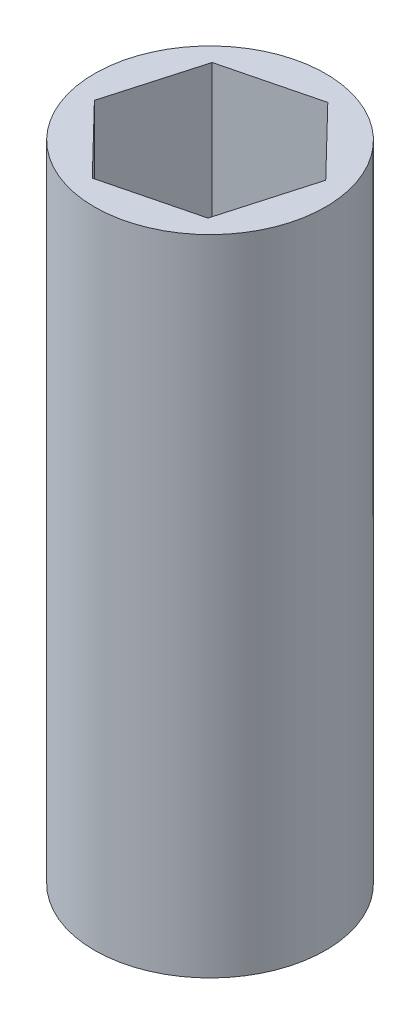
ISO-10303-21;
HEADER;
FILE_DESCRIPTION(('STEP AP214'),'2;1');
FILE_NAME('part.step','',(''),(''),'','','');
FILE_SCHEMA(('AUTOMOTIVE_DESIGN { 1 0 10303 214 1 1 1 1 }'));
ENDSEC;
DATA;
#1=APPLICATION_CONTEXT('core data for automotive mechanical design processes');
#2=APPLICATION_PROTOCOL_DEFINITION('international standard','automotive_design',2000,#1);
#3=PRODUCT_CONTEXT('',#1,'mechanical');
#4=PRODUCT('Part','Part','',(#3));
#5=PRODUCT_RELATED_PRODUCT_CATEGORY('part','',(#4));
#6=PRODUCT_DEFINITION_FORMATION('','',#4);
#7=PRODUCT_DEFINITION_CONTEXT('part definition',#1,'design');
#8=PRODUCT_DEFINITION('design','',#6,#7);
#9=PRODUCT_DEFINITION_SHAPE('','',#8);
#10=(LENGTH_UNIT() NAMED_UNIT(*) SI_UNIT(.MILLI.,.METRE.));
#11=(NAMED_UNIT(*) PLANE_ANGLE_UNIT() SI_UNIT($,.RADIAN.));
#12=(NAMED_UNIT(*) SI_UNIT($,.STERADIAN.) SOLID_ANGLE_UNIT());
#13=UNCERTAINTY_MEASURE_WITH_UNIT(LENGTH_MEASURE(1.E-05),#10,'distance_accuracy_value','');
#14=(GEOMETRIC_REPRESENTATION_CONTEXT(3) GLOBAL_UNCERTAINTY_ASSIGNED_CONTEXT((#13)) GLOBAL_UNIT_ASSIGNED_CONTEXT((#10,
#11,#12)) REPRESENTATION_CONTEXT('',''));
#15=CARTESIAN_POINT('',(0.,0.,0.));
#16=DIRECTION('',(0.,0.,1.));
#17=DIRECTION('',(1.,0.,0.));
#18=AXIS2_PLACEMENT_3D('',#15,#16,#17);
#19=CARTESIAN_POINT('',(0.,49.53,0.));
#20=DIRECTION('',(0.,1.,0.));
#21=DIRECTION('',(0.,0.,1.));
#22=AXIS2_PLACEMENT_3D('',#19,#20,#21);
#23=PLANE('',#22);
#24=CARTESIAN_POINT('',(0.,49.53,0.));
#25=DIRECTION('',(0.,1.,0.));
#26=DIRECTION('',(0.,0.,1.));
#27=AXIS2_PLACEMENT_3D('',#24,#25,#26);
#28=CIRCLE('',#27,8.89);
#29=CARTESIAN_POINT('',(0.,49.53,8.89));
#30=VERTEX_POINT('',#29);
#31=EDGE_CURVE('E11',#30,#30,#28,.T.);
#32=ORIENTED_EDGE('',*,*,#31,.T.);
#33=EDGE_LOOP('',(#32));
#34=FACE_BOUND('',#33,.T.);
#35=DIRECTION('',(-0.969830096251339,0.,0.243781837726108));
#36=VECTOR('',#35,1.);
#37=CARTESIAN_POINT('',(2.0075514167713,49.53,-7.05216779737641));
#38=LINE('',#37,#36);
#39=CARTESIAN_POINT('',(2.0075514167713,49.53,-7.05216779737641));
#40=VERTEX_POINT('',#39);
#41=CARTESIAN_POINT('',(-5.10358075589287,49.53,-5.2646744250156));
#42=VERTEX_POINT('',#41);
#43=EDGE_CURVE('E94',#40,#42,#38,.T.);
#44=ORIENTED_EDGE('',*,*,#43,.F.);
#45=DIRECTION('',(-0.696036312577735,0.,-0.718006581845313));
#46=VECTOR('',#45,1.);
#47=CARTESIAN_POINT('',(7.11113217266417,49.53,-1.78749337236082));
#48=LINE('',#47,#46);
#49=CARTESIAN_POINT('',(7.11113217266417,49.53,-1.78749337236082));
#50=VERTEX_POINT('',#49);
#51=EDGE_CURVE('E86',#50,#40,#48,.T.);
#52=ORIENTED_EDGE('',*,*,#51,.F.);
#53=DIRECTION('',(0.273793783673605,0.,-0.961788419571421));
#54=VECTOR('',#53,1.);
#55=CARTESIAN_POINT('',(5.10358075589287,49.53,5.2646744250156));
#56=LINE('',#55,#54);
#57=CARTESIAN_POINT('',(5.10358075589287,49.53,5.26467442501559));
#58=VERTEX_POINT('',#57);
#59=EDGE_CURVE('E114',#58,#50,#56,.T.);
#60=ORIENTED_EDGE('',*,*,#59,.F.);
#61=DIRECTION('',(0.969830096251339,0.,-0.243781837726108));
#62=VECTOR('',#61,1.);
#63=CARTESIAN_POINT('',(-2.0075514167713,49.53,7.05216779737641));
#64=LINE('',#63,#62);
#65=CARTESIAN_POINT('',(-2.0075514167713,49.53,7.05216779737641));
#66=VERTEX_POINT('',#65);
#67=EDGE_CURVE('E112',#66,#58,#64,.T.);
#68=ORIENTED_EDGE('',*,*,#67,.F.);
#69=DIRECTION('',(0.696036312577734,0.,0.718006581845313));
#70=VECTOR('',#69,1.);
#71=CARTESIAN_POINT('',(-7.11113217266417,49.53,1.78749337236082));
#72=LINE('',#71,#70);
#73=CARTESIAN_POINT('',(-7.11113217266417,49.53,1.78749337236082));
#74=VERTEX_POINT('',#73);
#75=EDGE_CURVE('E108',#74,#66,#72,.T.);
#76=ORIENTED_EDGE('',*,*,#75,.F.);
#77=DIRECTION('',(-0.273793783673604,0.,0.961788419571421));
#78=VECTOR('',#77,1.);
#79=CARTESIAN_POINT('',(-5.10358075589287,49.53,-5.2646744250156));
#80=LINE('',#79,#78);
#81=EDGE_CURVE('E106',#42,#74,#80,.T.);
#82=ORIENTED_EDGE('',*,*,#81,.F.);
#83=EDGE_LOOP('',(#44,#52,#60,#68,#76,#82));
#84=FACE_BOUND('',#83,.T.);
#85=ADVANCED_FACE('F33',(#34,#84),#23,.T.);
#86=CARTESIAN_POINT('',(0.,0.,0.));
#87=DIRECTION('',(0.,1.,0.));
#88=DIRECTION('',(0.,0.,1.));
#89=AXIS2_PLACEMENT_3D('',#86,#87,#88);
#90=PLANE('',#89);
#91=CARTESIAN_POINT('',(0.,0.,0.));
#92=DIRECTION('',(0.,1.,0.));
#93=DIRECTION('',(0.,0.,1.));
#94=AXIS2_PLACEMENT_3D('',#91,#92,#93);
#95=CIRCLE('',#94,8.89);
#96=CARTESIAN_POINT('',(0.,0.,8.89));
#97=VERTEX_POINT('',#96);
#98=EDGE_CURVE('E37',#97,#97,#95,.T.);
#99=ORIENTED_EDGE('',*,*,#98,.F.);
#100=EDGE_LOOP('',(#99));
#101=FACE_BOUND('',#100,.T.);
#102=DIRECTION('',(-0.696036312577735,0.,-0.718006581845313));
#103=VECTOR('',#102,1.);
#104=CARTESIAN_POINT('',(7.11113217266417,0.,-1.78749337236082));
#105=LINE('',#104,#103);
#106=CARTESIAN_POINT('',(7.11113217266417,0.,-1.78749337236082));
#107=VERTEX_POINT('',#106);
#108=CARTESIAN_POINT('',(2.0075514167713,0.,-7.05216779737641));
#109=VERTEX_POINT('',#108);
#110=EDGE_CURVE('E56',#107,#109,#105,.T.);
#111=ORIENTED_EDGE('',*,*,#110,.T.);
#112=DIRECTION('',(-0.969830096251339,0.,0.243781837726108));
#113=VECTOR('',#112,1.);
#114=CARTESIAN_POINT('',(2.0075514167713,0.,-7.05216779737641));
#115=LINE('',#114,#113);
#116=CARTESIAN_POINT('',(-5.10358075589287,0.,-5.2646744250156));
#117=VERTEX_POINT('',#116);
#118=EDGE_CURVE('E101',#109,#117,#115,.T.);
#119=ORIENTED_EDGE('',*,*,#118,.T.);
#120=DIRECTION('',(-0.273793783673604,0.,0.961788419571421));
#121=VECTOR('',#120,1.);
#122=CARTESIAN_POINT('',(-5.10358075589287,0.,-5.2646744250156));
#123=LINE('',#122,#121);
#124=CARTESIAN_POINT('',(-7.11113217266417,0.,1.78749337236082));
#125=VERTEX_POINT('',#124);
#126=EDGE_CURVE('E118',#117,#125,#123,.T.);
#127=ORIENTED_EDGE('',*,*,#126,.T.);
#128=DIRECTION('',(0.696036312577734,0.,0.718006581845313));
#129=VECTOR('',#128,1.);
#130=CARTESIAN_POINT('',(-7.11113217266417,0.,1.78749337236082));
#131=LINE('',#130,#129);
#132=CARTESIAN_POINT('',(-2.0075514167713,0.,7.05216779737641));
#133=VERTEX_POINT('',#132);
#134=EDGE_CURVE('E121',#125,#133,#131,.T.);
#135=ORIENTED_EDGE('',*,*,#134,.T.);
#136=DIRECTION('',(0.969830096251339,0.,-0.243781837726108));
#137=VECTOR('',#136,1.);
#138=CARTESIAN_POINT('',(-2.0075514167713,0.,7.05216779737641));
#139=LINE('',#138,#137);
#140=CARTESIAN_POINT('',(5.10358075589287,0.,5.2646744250156));
#141=VERTEX_POINT('',#140);
#142=EDGE_CURVE('E124',#133,#141,#139,.T.);
#143=ORIENTED_EDGE('',*,*,#142,.T.);
#144=DIRECTION('',(0.273793783673605,0.,-0.961788419571421));
#145=VECTOR('',#144,1.);
#146=CARTESIAN_POINT('',(5.10358075589287,0.,5.2646744250156));
#147=LINE('',#146,#145);
#148=EDGE_CURVE('E95',#141,#107,#147,.T.);
#149=ORIENTED_EDGE('',*,*,#148,.T.);
#150=EDGE_LOOP('',(#111,#119,#127,#135,#143,#149));
#151=FACE_BOUND('',#150,.T.);
#152=ADVANCED_FACE('F141',(#101,#151),#90,.F.);
#153=CARTESIAN_POINT('',(0.,49.53,0.));
#154=DIRECTION('',(0.,-1.,0.));
#155=DIRECTION('',(0.,0.,-1.));
#156=AXIS2_PLACEMENT_3D('',#153,#154,#155);
#157=CYLINDRICAL_SURFACE('',#156,8.89);
#158=ORIENTED_EDGE('',*,*,#31,.F.);
#159=EDGE_LOOP('',(#158));
#160=FACE_BOUND('',#159,.T.);
#161=ORIENTED_EDGE('',*,*,#98,.T.);
#162=EDGE_LOOP('',(#161));
#163=FACE_BOUND('',#162,.T.);
#164=ADVANCED_FACE('F35',(#160,#163),#157,.T.);
#165=CARTESIAN_POINT('',(7.11113217266417,49.53,-1.78749337236082));
#166=DIRECTION('',(-0.718006581845313,0.,0.696036312577735));
#167=DIRECTION('',(0.696036312577735,0.,0.718006581845313));
#168=AXIS2_PLACEMENT_3D('',#165,#166,#167);
#169=PLANE('',#168);
#170=ORIENTED_EDGE('',*,*,#110,.F.);
#171=DIRECTION('',(0.,-1.,0.));
#172=VECTOR('',#171,1.);
#173=CARTESIAN_POINT('',(7.11113217266417,49.53,-1.78749337236082));
#174=LINE('',#173,#172);
#175=EDGE_CURVE('E90',#50,#107,#174,.T.);
#176=ORIENTED_EDGE('',*,*,#175,.F.);
#177=ORIENTED_EDGE('',*,*,#51,.T.);
#178=DIRECTION('',(0.,-1.,0.));
#179=VECTOR('',#178,1.);
#180=CARTESIAN_POINT('',(2.0075514167713,49.53,-7.05216779737641));
#181=LINE('',#180,#179);
#182=EDGE_CURVE('E89',#40,#109,#181,.T.);
#183=ORIENTED_EDGE('',*,*,#182,.T.);
#184=EDGE_LOOP('',(#170,#176,#177,#183));
#185=FACE_BOUND('',#184,.T.);
#186=ADVANCED_FACE('F88',(#185),#169,.T.);
#187=CARTESIAN_POINT('',(2.0075514167713,49.53,-7.05216779737641));
#188=DIRECTION('',(0.243781837726108,0.,0.969830096251339));
#189=DIRECTION('',(0.969830096251339,0.,-0.243781837726108));
#190=AXIS2_PLACEMENT_3D('',#187,#188,#189);
#191=PLANE('',#190);
#192=ORIENTED_EDGE('',*,*,#118,.F.);
#193=ORIENTED_EDGE('',*,*,#182,.F.);
#194=ORIENTED_EDGE('',*,*,#43,.T.);
#195=DIRECTION('',(0.,-1.,0.));
#196=VECTOR('',#195,1.);
#197=CARTESIAN_POINT('',(-5.10358075589287,49.53,-5.2646744250156));
#198=LINE('',#197,#196);
#199=EDGE_CURVE('E102',#42,#117,#198,.T.);
#200=ORIENTED_EDGE('',*,*,#199,.T.);
#201=EDGE_LOOP('',(#192,#193,#194,#200));
#202=FACE_BOUND('',#201,.T.);
#203=ADVANCED_FACE('F98',(#202),#191,.T.);
#204=CARTESIAN_POINT('',(-5.10358075589287,49.53,-5.2646744250156));
#205=DIRECTION('',(0.961788419571421,0.,0.273793783673604));
#206=DIRECTION('',(0.273793783673604,0.,-0.961788419571421));
#207=AXIS2_PLACEMENT_3D('',#204,#205,#206);
#208=PLANE('',#207);
#209=ORIENTED_EDGE('',*,*,#126,.F.);
#210=ORIENTED_EDGE('',*,*,#199,.F.);
#211=ORIENTED_EDGE('',*,*,#81,.T.);
#212=DIRECTION('',(0.,-1.,0.));
#213=VECTOR('',#212,1.);
#214=CARTESIAN_POINT('',(-7.11113217266417,49.53,1.78749337236082));
#215=LINE('',#214,#213);
#216=EDGE_CURVE('E133',#74,#125,#215,.T.);
#217=ORIENTED_EDGE('',*,*,#216,.T.);
#218=EDGE_LOOP('',(#209,#210,#211,#217));
#219=FACE_BOUND('',#218,.T.);
#220=ADVANCED_FACE('F137',(#219),#208,.T.);
#221=CARTESIAN_POINT('',(-7.11113217266417,49.53,1.78749337236082));
#222=DIRECTION('',(0.718006581845313,0.,-0.696036312577734));
#223=DIRECTION('',(-0.696036312577734,0.,-0.718006581845313));
#224=AXIS2_PLACEMENT_3D('',#221,#222,#223);
#225=PLANE('',#224);
#226=ORIENTED_EDGE('',*,*,#134,.F.);
#227=ORIENTED_EDGE('',*,*,#216,.F.);
#228=ORIENTED_EDGE('',*,*,#75,.T.);
#229=DIRECTION('',(0.,-1.,0.));
#230=VECTOR('',#229,1.);
#231=CARTESIAN_POINT('',(-2.0075514167713,49.53,7.05216779737641));
#232=LINE('',#231,#230);
#233=EDGE_CURVE('E131',#66,#133,#232,.T.);
#234=ORIENTED_EDGE('',*,*,#233,.T.);
#235=EDGE_LOOP('',(#226,#227,#228,#234));
#236=FACE_BOUND('',#235,.T.);
#237=ADVANCED_FACE('F149',(#236),#225,.T.);
#238=CARTESIAN_POINT('',(-2.0075514167713,49.53,7.05216779737641));
#239=DIRECTION('',(-0.243781837726108,0.,-0.969830096251339));
#240=DIRECTION('',(-0.969830096251339,0.,0.243781837726108));
#241=AXIS2_PLACEMENT_3D('',#238,#239,#240);
#242=PLANE('',#241);
#243=ORIENTED_EDGE('',*,*,#142,.F.);
#244=ORIENTED_EDGE('',*,*,#233,.F.);
#245=ORIENTED_EDGE('',*,*,#67,.T.);
#246=DIRECTION('',(0.,-1.,0.));
#247=VECTOR('',#246,1.);
#248=CARTESIAN_POINT('',(5.10358075589287,49.53,5.2646744250156));
#249=LINE('',#248,#247);
#250=EDGE_CURVE('E48',#58,#141,#249,.T.);
#251=ORIENTED_EDGE('',*,*,#250,.T.);
#252=EDGE_LOOP('',(#243,#244,#245,#251));
#253=FACE_BOUND('',#252,.T.);
#254=ADVANCED_FACE('F147',(#253),#242,.T.);
#255=CARTESIAN_POINT('',(5.10358075589287,49.53,5.2646744250156));
#256=DIRECTION('',(-0.961788419571421,0.,-0.273793783673605));
#257=DIRECTION('',(-0.273793783673605,0.,0.961788419571421));
#258=AXIS2_PLACEMENT_3D('',#255,#256,#257);
#259=PLANE('',#258);
#260=ORIENTED_EDGE('',*,*,#148,.F.);
#261=ORIENTED_EDGE('',*,*,#250,.F.);
#262=ORIENTED_EDGE('',*,*,#59,.T.);
#263=ORIENTED_EDGE('',*,*,#175,.T.);
#264=EDGE_LOOP('',(#260,#261,#262,#263));
#265=FACE_BOUND('',#264,.T.);
#266=ADVANCED_FACE('F143',(#265),#259,.T.);
#267=CLOSED_SHELL('',(#85,#152,#164,#186,#203,#220,#237,#254,#266));
#268=MANIFOLD_SOLID_BREP('B2',#267);
#269=ADVANCED_BREP_SHAPE_REPRESENTATION('',(#18,#268),#14);
#270=SHAPE_DEFINITION_REPRESENTATION(#9,#269);
ENDSEC;
END-ISO-10303-21;
